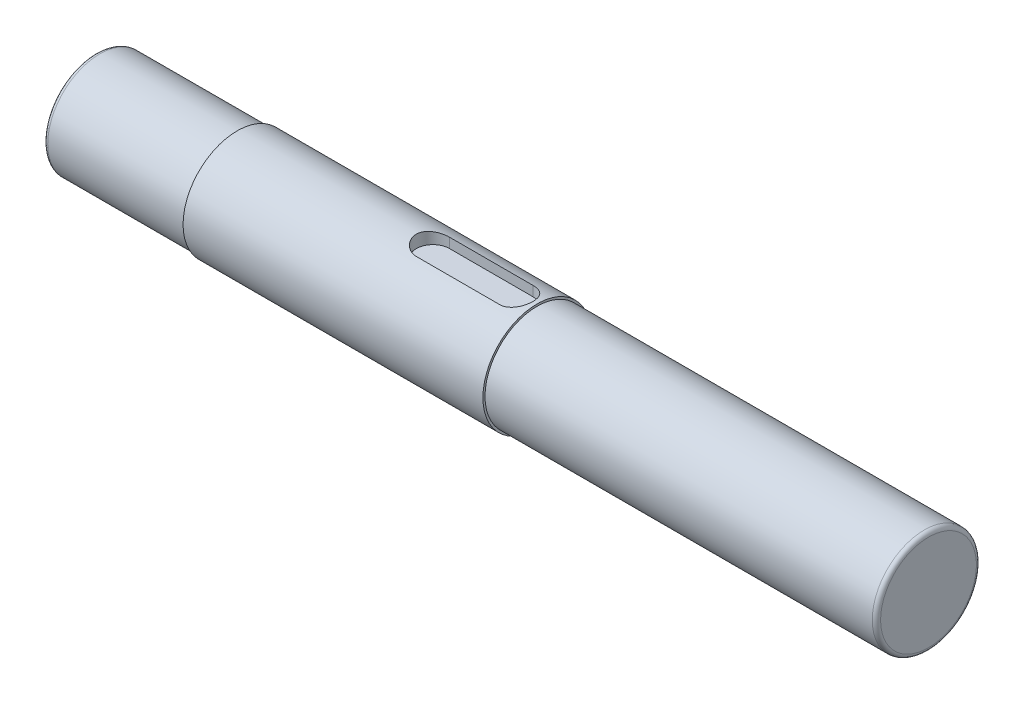
ISO-10303-21;
HEADER;
FILE_DESCRIPTION(('STEP AP214'),'2;1');
FILE_NAME('part.step','',(''),(''),'','','');
FILE_SCHEMA(('AUTOMOTIVE_DESIGN { 1 0 10303 214 1 1 1 1 }'));
ENDSEC;
DATA;
#1=APPLICATION_CONTEXT('core data for automotive mechanical design processes');
#2=APPLICATION_PROTOCOL_DEFINITION('international standard','automotive_design',2000,#1);
#3=PRODUCT_CONTEXT('',#1,'mechanical');
#4=PRODUCT('Part','Part','',(#3));
#5=PRODUCT_RELATED_PRODUCT_CATEGORY('part','',(#4));
#6=PRODUCT_DEFINITION_FORMATION('','',#4);
#7=PRODUCT_DEFINITION_CONTEXT('part definition',#1,'design');
#8=PRODUCT_DEFINITION('design','',#6,#7);
#9=PRODUCT_DEFINITION_SHAPE('','',#8);
#10=(LENGTH_UNIT() NAMED_UNIT(*) SI_UNIT(.MILLI.,.METRE.));
#11=(NAMED_UNIT(*) PLANE_ANGLE_UNIT() SI_UNIT($,.RADIAN.));
#12=(NAMED_UNIT(*) SI_UNIT($,.STERADIAN.) SOLID_ANGLE_UNIT());
#13=UNCERTAINTY_MEASURE_WITH_UNIT(LENGTH_MEASURE(1.E-05),#10,'distance_accuracy_value','');
#14=(GEOMETRIC_REPRESENTATION_CONTEXT(3) GLOBAL_UNCERTAINTY_ASSIGNED_CONTEXT((#13)) GLOBAL_UNIT_ASSIGNED_CONTEXT((#10,
#11,#12)) REPRESENTATION_CONTEXT('',''));
#15=CARTESIAN_POINT('',(0.,0.,0.));
#16=DIRECTION('',(0.,0.,1.));
#17=DIRECTION('',(1.,0.,0.));
#18=AXIS2_PLACEMENT_3D('',#15,#16,#17);
#19=CARTESIAN_POINT('',(7.6095238095238,0.,0.));
#20=DIRECTION('',(1.,0.,0.));
#21=DIRECTION('',(0.,0.,-1.));
#22=AXIS2_PLACEMENT_3D('',#19,#20,#21);
#23=PLANE('',#22);
#24=CARTESIAN_POINT('',(7.6095238095238,0.,0.));
#25=DIRECTION('',(1.,0.,0.));
#26=DIRECTION('',(0.,0.,-1.));
#27=AXIS2_PLACEMENT_3D('',#24,#25,#26);
#28=CIRCLE('',#27,11.5);
#29=CARTESIAN_POINT('',(7.6095238095238,0.,-11.5));
#30=VERTEX_POINT('',#29);
#31=EDGE_CURVE('E299',#30,#30,#28,.F.);
#32=ORIENTED_EDGE('',*,*,#31,.T.);
#33=EDGE_LOOP('',(#32));
#34=FACE_BOUND('',#33,.T.);
#35=ADVANCED_FACE('F71',(#34),#23,.F.);
#36=CARTESIAN_POINT('',(0.,0.,0.));
#37=DIRECTION('',(-1.,0.,0.));
#38=DIRECTION('',(0.,0.,1.));
#39=AXIS2_PLACEMENT_3D('',#36,#37,#38);
#40=CYLINDRICAL_SURFACE('',#39,12.5);
#41=CARTESIAN_POINT('',(8.6095238095238,0.,0.));
#42=DIRECTION('',(1.,0.,0.));
#43=DIRECTION('',(0.,0.,-1.));
#44=AXIS2_PLACEMENT_3D('',#41,#42,#43);
#45=CIRCLE('',#44,12.5);
#46=CARTESIAN_POINT('',(8.6095238095238,0.,-12.5));
#47=VERTEX_POINT('',#46);
#48=EDGE_CURVE('E307',#47,#47,#45,.T.);
#49=ORIENTED_EDGE('',*,*,#48,.T.);
#50=EDGE_LOOP('',(#49));
#51=FACE_BOUND('',#50,.T.);
#52=CARTESIAN_POINT('',(41.6095238095238,0.,0.));
#53=DIRECTION('',(-1.,0.,0.));
#54=DIRECTION('',(0.,0.,1.));
#55=AXIS2_PLACEMENT_3D('',#52,#53,#54);
#56=CIRCLE('',#55,12.5);
#57=CARTESIAN_POINT('',(41.6095238095238,0.,12.5));
#58=VERTEX_POINT('',#57);
#59=EDGE_CURVE('E219',#58,#58,#56,.T.);
#60=ORIENTED_EDGE('',*,*,#59,.T.);
#61=EDGE_LOOP('',(#60));
#62=FACE_BOUND('',#61,.T.);
#63=ADVANCED_FACE('F268',(#51,#62),#40,.T.);
#64=CARTESIAN_POINT('',(41.6095238095238,12.5,0.));
#65=DIRECTION('',(1.,0.,0.));
#66=DIRECTION('',(0.,0.,-1.));
#67=AXIS2_PLACEMENT_3D('',#64,#65,#66);
#68=PLANE('',#67);
#69=ORIENTED_EDGE('',*,*,#59,.F.);
#70=EDGE_LOOP('',(#69));
#71=FACE_BOUND('',#70,.T.);
#72=CARTESIAN_POINT('',(41.6095238095238,0.,0.));
#73=DIRECTION('',(-1.,0.,0.));
#74=DIRECTION('',(0.,0.,1.));
#75=AXIS2_PLACEMENT_3D('',#72,#73,#74);
#76=CIRCLE('',#75,13.);
#77=CARTESIAN_POINT('',(41.6095238095238,0.,13.));
#78=VERTEX_POINT('',#77);
#79=EDGE_CURVE('E215',#78,#78,#76,.T.);
#80=ORIENTED_EDGE('',*,*,#79,.T.);
#81=EDGE_LOOP('',(#80));
#82=FACE_BOUND('',#81,.T.);
#83=ADVANCED_FACE('F274',(#71,#82),#68,.F.);
#84=CARTESIAN_POINT('',(0.,0.,0.));
#85=DIRECTION('',(-1.,0.,0.));
#86=DIRECTION('',(0.,0.,1.));
#87=AXIS2_PLACEMENT_3D('',#84,#85,#86);
#88=CYLINDRICAL_SURFACE('',#87,13.);
#89=DIRECTION('',(-1.,0.,0.));
#90=VECTOR('',#89,1.);
#91=CARTESIAN_POINT('',(0.,12.369316876853,-4.));
#92=LINE('',#91,#90);
#93=CARTESIAN_POINT('',(88.6095238095238,12.369316876853,-4.));
#94=VERTEX_POINT('',#93);
#95=CARTESIAN_POINT('',(108.609523809524,12.369316876853,-4.));
#96=VERTEX_POINT('',#95);
#97=EDGE_CURVE('E12',#94,#96,#92,.F.);
#98=ORIENTED_EDGE('',*,*,#97,.T.);
#99=CARTESIAN_POINT('',(108.609523809524,12.369316876853,-4.));
#100=CARTESIAN_POINT('',(108.719161069568,12.3693011060559,-4.00001385554605));
#101=CARTESIAN_POINT('',(108.828789340904,12.3707741918502,-3.99549264927955));
#102=CARTESIAN_POINT('',(109.047206179603,12.3765808295348,-3.97748793948736));
#103=CARTESIAN_POINT('',(109.15599493797,12.3809137101209,-3.96400653926006));
#104=CARTESIAN_POINT('',(109.371679960723,12.3923078282768,-3.9282361528359));
#105=CARTESIAN_POINT('',(109.478580440909,12.399361878995,-3.90597036349973));
#106=CARTESIAN_POINT('',(109.689999698896,12.4159696129904,-3.85285190224662));
#107=CARTESIAN_POINT('',(109.79451840914,12.4255233670738,-3.82199898709017));
#108=CARTESIAN_POINT('',(110.103337421468,12.4575175837827,-3.71694513232446));
#109=CARTESIAN_POINT('',(110.303184773377,12.483307156321,-3.63020142616738));
#110=CARTESIAN_POINT('',(110.685496866216,12.5408839490093,-3.42599155981652));
#111=CARTESIAN_POINT('',(110.867952880525,12.572674156561,-3.30851008560228));
#112=CARTESIAN_POINT('',(111.216418280009,12.639849464286,-3.04197546692094));
#113=CARTESIAN_POINT('',(111.381770215115,12.6753137902419,-2.892081048213));
#114=CARTESIAN_POINT('',(111.68542887014,12.7451676286833,-2.56677638136854));
#115=CARTESIAN_POINT('',(111.823730970246,12.7795569567298,-2.391361783573));
#116=CARTESIAN_POINT('',(112.07227295929,12.8442939900254,-2.01525564040857));
#117=CARTESIAN_POINT('',(112.181833255872,12.8745369018167,-1.81409533176948));
#118=CARTESIAN_POINT('',(112.365304923956,12.9266435229377,-1.39512400470614));
#119=CARTESIAN_POINT('',(112.439225861867,12.9485094805068,-1.17731747270964));
#120=CARTESIAN_POINT('',(112.547124646301,12.980836680659,-0.738159816541966));
#121=CARTESIAN_POINT('',(112.582233643573,12.9916202110484,-0.517110769217928));
#122=CARTESIAN_POINT('',(112.615093066478,13.0017046486491,-0.0720095541966277));
#123=CARTESIAN_POINT('',(112.612850968841,13.0010078539271,0.152042003503076));
#124=CARTESIAN_POINT('',(112.571820628437,12.9884354452262,0.588828322821336));
#125=CARTESIAN_POINT('',(112.534258740302,12.976934963743,0.801690801267575));
#126=CARTESIAN_POINT('',(112.425663661769,12.9445067865243,1.21792737916861));
#127=CARTESIAN_POINT('',(112.354628688465,12.923578588635,1.42130097257467));
#128=CARTESIAN_POINT('',(112.180301444969,12.8741371346781,1.81565284792357));
#129=CARTESIAN_POINT('',(112.076631492816,12.8455356806846,2.00645263453306));
#130=CARTESIAN_POINT('',(111.840269522447,12.7837686435913,2.36833420473324));
#131=CARTESIAN_POINT('',(111.707570673614,12.7506019869631,2.53941133301027));
#132=CARTESIAN_POINT('',(111.410648898159,12.6816648743268,2.86427703670677));
#133=CARTESIAN_POINT('',(111.245369605203,12.6458433558745,3.01708885727141));
#134=CARTESIAN_POINT('',(110.891036459927,12.5767737605626,3.29318735472968));
#135=CARTESIAN_POINT('',(110.701975563289,12.5435264509396,3.41646525186121));
#136=CARTESIAN_POINT('',(110.403363411261,12.4983185398609,3.57703281324441));
#137=CARTESIAN_POINT('',(110.300660110085,12.4839545575701,3.62672040705995));
#138=CARTESIAN_POINT('',(110.091169262062,12.4573073197885,3.7172196774293));
#139=CARTESIAN_POINT('',(109.984383413734,12.4450232102832,3.75803499898249));
#140=CARTESIAN_POINT('',(109.767598395146,12.4229432446499,3.8303933226437));
#141=CARTESIAN_POINT('',(109.657602766054,12.413144753996,3.86194614776658));
#142=CARTESIAN_POINT('',(109.435152474813,12.3963449677289,3.91553543389294));
#143=CARTESIAN_POINT('',(109.322698969304,12.3893423850733,3.93757627393456));
#144=CARTESIAN_POINT('',(109.11021189705,12.3790500430556,3.96980876445186));
#145=CARTESIAN_POINT('',(109.010365129732,12.3754078485105,3.98112989977237));
#146=CARTESIAN_POINT('',(108.810189444419,12.3705374921443,3.9962248840057));
#147=CARTESIAN_POINT('',(108.709861426896,12.3693058643752,4.00000956907256));
#148=CARTESIAN_POINT('',(108.609523809524,12.369316876853,4.));
#149=B_SPLINE_CURVE_WITH_KNOTS('',3,(#99,#100,#101,#102,#103,#104,#105,#106,#107,#108,#109,#110,
#111,#112,#113,#114,#115,#116,#117,#118,#119,#120,#121,#122,#123,#124,#125,#126,#127,#128,#129,
#130,#131,#132,#133,#134,#135,#136,#137,#138,#139,#140,#141,#142,#143,#144,#145,#146,#147,#148),
.UNSPECIFIED.,.F.,.F.,(4,2,2,2,2,2,2,2,2,2,2,2,2,2,2,2,2,2,2,2,2,2,2,2,4),(0.,0.328793421203149,
0.65750968932791,0.985363667706895,1.31322693384514,1.96809857989085,2.6232971162299,
3.29814780038951,3.97311364113685,4.66283549043959,5.35237209962388,6.02123451698755,
6.68996304687303,7.33629750679724,7.98266639687212,8.63680913532383,9.2911059621096,
9.97181686260364,10.6527298725226,10.9973477032526,11.3418236857872,11.6859330155993,
12.0298837581651,12.3312338730857,12.6321503832144),.UNSPECIFIED.);
#150=CARTESIAN_POINT('',(108.609523809524,12.369316876853,4.));
#151=VERTEX_POINT('',#150);
#152=EDGE_CURVE('E311',#96,#151,#149,.T.);
#153=ORIENTED_EDGE('',*,*,#152,.T.);
#154=DIRECTION('',(-1.,0.,0.));
#155=VECTOR('',#154,1.);
#156=CARTESIAN_POINT('',(0.,12.369316876853,4.));
#157=LINE('',#156,#155);
#158=CARTESIAN_POINT('',(88.6095238095238,12.369316876853,4.));
#159=VERTEX_POINT('',#158);
#160=EDGE_CURVE('E80',#151,#159,#157,.T.);
#161=ORIENTED_EDGE('',*,*,#160,.T.);
#162=CARTESIAN_POINT('',(88.6095238095238,12.369316876853,4.));
#163=CARTESIAN_POINT('',(88.4998865494792,12.3693011060559,4.00001385554605));
#164=CARTESIAN_POINT('',(88.3902582781433,12.3707741918502,3.99549264927955));
#165=CARTESIAN_POINT('',(88.1718414394449,12.3765808295348,3.97748793948736));
#166=CARTESIAN_POINT('',(88.0630526810779,12.3809137101209,3.96400653926006));
#167=CARTESIAN_POINT('',(87.8473676583249,12.3923078282768,3.9282361528359));
#168=CARTESIAN_POINT('',(87.7404671781385,12.399361878995,3.90597036349973));
#169=CARTESIAN_POINT('',(87.5290479201514,12.4159696129904,3.85285190224662));
#170=CARTESIAN_POINT('',(87.4245292099075,12.4255233670738,3.82199898709017));
#171=CARTESIAN_POINT('',(87.1157101975799,12.4575175837827,3.71694513232447));
#172=CARTESIAN_POINT('',(86.9158628456706,12.483307156321,3.63020142616738));
#173=CARTESIAN_POINT('',(86.5335507528315,12.5408839490093,3.42599155981653));
#174=CARTESIAN_POINT('',(86.3510947385224,12.572674156561,3.30851008560229));
#175=CARTESIAN_POINT('',(86.0026293390387,12.639849464286,3.04197546692094));
#176=CARTESIAN_POINT('',(85.8372774039326,12.6753137902419,2.892081048213));
#177=CARTESIAN_POINT('',(85.5336187489077,12.7451676286833,2.56677638136855));
#178=CARTESIAN_POINT('',(85.3953166488018,12.7795569567298,2.391361783573));
#179=CARTESIAN_POINT('',(85.1467746597575,12.8442939900254,2.01525564040856));
#180=CARTESIAN_POINT('',(85.0372143631761,12.8745369018167,1.81409533176948));
#181=CARTESIAN_POINT('',(84.8537426950913,12.9266435229377,1.39512400470614));
#182=CARTESIAN_POINT('',(84.7798217571801,12.9485094805068,1.17731747270964));
#183=CARTESIAN_POINT('',(84.6719229727468,12.980836680659,0.738159816541966));
#184=CARTESIAN_POINT('',(84.6368139754744,12.9916202110484,0.517110769217928));
#185=CARTESIAN_POINT('',(84.6039545525696,13.0017046486491,0.072009554196628));
#186=CARTESIAN_POINT('',(84.6061966502066,13.0010078539271,-0.152042003503076));
#187=CARTESIAN_POINT('',(84.6472269906101,12.9884354452262,-0.588828322821337));
#188=CARTESIAN_POINT('',(84.6847888787455,12.976934963743,-0.801690801267578));
#189=CARTESIAN_POINT('',(84.7933839572789,12.9445067865243,-1.21792737916861));
#190=CARTESIAN_POINT('',(84.8644189305823,12.923578588635,-1.42130097257467));
#191=CARTESIAN_POINT('',(85.0387461740784,12.8741371346781,-1.81565284792358));
#192=CARTESIAN_POINT('',(85.1424161262319,12.8455356806846,-2.00645263453306));
#193=CARTESIAN_POINT('',(85.3787780966005,12.7837686435913,-2.36833420473324));
#194=CARTESIAN_POINT('',(85.5114769454333,12.7506019869631,-2.53941133301027));
#195=CARTESIAN_POINT('',(85.8083987208882,12.6816648743268,-2.86427703670677));
#196=CARTESIAN_POINT('',(85.9736780138446,12.6458433558745,-3.01708885727141));
#197=CARTESIAN_POINT('',(86.3280111591204,12.5767737605626,-3.29318735472968));
#198=CARTESIAN_POINT('',(86.5170720557584,12.5435264509396,-3.41646525186121));
#199=CARTESIAN_POINT('',(86.8156842077862,12.4983185398609,-3.57703281324441));
#200=CARTESIAN_POINT('',(86.918387508963,12.4839545575701,-3.62672040705996));
#201=CARTESIAN_POINT('',(87.1278783569855,12.4573073197885,-3.7172196774293));
#202=CARTESIAN_POINT('',(87.234664205314,12.4450232102832,-3.75803499898249));
#203=CARTESIAN_POINT('',(87.4514492239018,12.4229432446499,-3.83039332264369));
#204=CARTESIAN_POINT('',(87.5614448529935,12.413144753996,-3.86194614776658));
#205=CARTESIAN_POINT('',(87.7838951442344,12.3963449677289,-3.91553543389294));
#206=CARTESIAN_POINT('',(87.8963486497438,12.3893423850733,-3.93757627393456));
#207=CARTESIAN_POINT('',(88.1088357219976,12.3790500430556,-3.96980876445186));
#208=CARTESIAN_POINT('',(88.2086824893152,12.3754078485105,-3.98112989977237));
#209=CARTESIAN_POINT('',(88.4088581746287,12.3705374921443,-3.9962248840057));
#210=CARTESIAN_POINT('',(88.5091861921521,12.3693058643752,-4.00000956907256));
#211=CARTESIAN_POINT('',(88.6095238095238,12.369316876853,-4.));
#212=B_SPLINE_CURVE_WITH_KNOTS('',3,(#162,#163,#164,#165,#166,#167,#168,#169,#170,#171,#172,
#173,#174,#175,#176,#177,#178,#179,#180,#181,#182,#183,#184,#185,#186,#187,#188,#189,#190,#191,
#192,#193,#194,#195,#196,#197,#198,#199,#200,#201,#202,#203,#204,#205,#206,#207,#208,#209,#210,
#211),.UNSPECIFIED.,.F.,.F.,(4,2,2,2,2,2,2,2,2,2,2,2,2,2,2,2,2,2,2,2,2,2,2,2,4),(0.,
0.328793421203149,0.65750968932791,0.985363667706909,1.31322693384514,1.96809857989083,
2.6232971162299,3.2981478003895,3.97311364113685,4.66283549043959,5.35237209962388,
6.02123451698755,6.68996304687303,7.33629750679724,7.98266639687212,8.63680913532383,
9.2911059621096,9.97181686260362,10.6527298725226,10.9973477032526,11.3418236857872,
11.6859330155993,12.0298837581651,12.3312338730857,12.6321503832144),.UNSPECIFIED.);
#213=EDGE_CURVE('E87',#159,#94,#212,.T.);
#214=ORIENTED_EDGE('',*,*,#213,.T.);
#215=EDGE_LOOP('',(#98,#153,#161,#214));
#216=FACE_BOUND('',#215,.T.);
#217=ORIENTED_EDGE('',*,*,#79,.F.);
#218=EDGE_LOOP('',(#217));
#219=FACE_BOUND('',#218,.T.);
#220=CARTESIAN_POINT('',(113.609523809524,0.,0.));
#221=DIRECTION('',(-1.,0.,0.));
#222=DIRECTION('',(0.,0.,1.));
#223=AXIS2_PLACEMENT_3D('',#220,#221,#222);
#224=CIRCLE('',#223,13.);
#225=CARTESIAN_POINT('',(113.609523809524,0.,13.));
#226=VERTEX_POINT('',#225);
#227=EDGE_CURVE('E211',#226,#226,#224,.T.);
#228=ORIENTED_EDGE('',*,*,#227,.T.);
#229=EDGE_LOOP('',(#228));
#230=FACE_BOUND('',#229,.T.);
#231=ADVANCED_FACE('F326',(#216,#219,#230),#88,.T.);
#232=CARTESIAN_POINT('',(113.609523809524,13.,0.));
#233=DIRECTION('',(-1.,0.,0.));
#234=DIRECTION('',(0.,0.,1.));
#235=AXIS2_PLACEMENT_3D('',#232,#233,#234);
#236=PLANE('',#235);
#237=ORIENTED_EDGE('',*,*,#227,.F.);
#238=EDGE_LOOP('',(#237));
#239=FACE_BOUND('',#238,.T.);
#240=CARTESIAN_POINT('',(113.609523809524,0.,0.));
#241=DIRECTION('',(-1.,0.,0.));
#242=DIRECTION('',(0.,0.,1.));
#243=AXIS2_PLACEMENT_3D('',#240,#241,#242);
#244=CIRCLE('',#243,12.5);
#245=CARTESIAN_POINT('',(113.609523809524,0.,12.5));
#246=VERTEX_POINT('',#245);
#247=EDGE_CURVE('E197',#246,#246,#244,.T.);
#248=ORIENTED_EDGE('',*,*,#247,.T.);
#249=EDGE_LOOP('',(#248));
#250=FACE_BOUND('',#249,.T.);
#251=ADVANCED_FACE('F264',(#239,#250),#236,.F.);
#252=CARTESIAN_POINT('',(0.,0.,0.));
#253=DIRECTION('',(-1.,0.,0.));
#254=DIRECTION('',(0.,0.,1.));
#255=AXIS2_PLACEMENT_3D('',#252,#253,#254);
#256=CYLINDRICAL_SURFACE('',#255,12.5);
#257=CARTESIAN_POINT('',(206.609523809524,0.,0.));
#258=DIRECTION('',(-1.,0.,0.));
#259=DIRECTION('',(0.,0.,1.));
#260=AXIS2_PLACEMENT_3D('',#257,#258,#259);
#261=CIRCLE('',#260,12.5);
#262=CARTESIAN_POINT('',(206.609523809524,0.,12.5));
#263=VERTEX_POINT('',#262);
#264=EDGE_CURVE('E293',#263,#263,#261,.T.);
#265=ORIENTED_EDGE('',*,*,#264,.T.);
#266=EDGE_LOOP('',(#265));
#267=FACE_BOUND('',#266,.T.);
#268=DIRECTION('',(-1.,0.,0.));
#269=VECTOR('',#268,1.);
#270=CARTESIAN_POINT('',(0.,-11.842719282327,-4.));
#271=LINE('',#270,#269);
#272=CARTESIAN_POINT('',(139.309523809524,-11.842719282327,-4.));
#273=VERTEX_POINT('',#272);
#274=CARTESIAN_POINT('',(119.309523809524,-11.842719282327,-4.));
#275=VERTEX_POINT('',#274);
#276=EDGE_CURVE('E295',#273,#275,#271,.T.);
#277=ORIENTED_EDGE('',*,*,#276,.T.);
#278=CARTESIAN_POINT('',(119.309523809524,-11.842719282327,-4.));
#279=CARTESIAN_POINT('',(119.200124037562,-11.8427027366058,-4.00001410484613));
#280=CARTESIAN_POINT('',(119.090733599676,-11.8442348052368,-3.995512175201));
#281=CARTESIAN_POINT('',(118.872795568787,-11.8502730910574,-3.97758606678449));
#282=CARTESIAN_POINT('',(118.764247771039,-11.8547785613244,-3.96416412872571));
#283=CARTESIAN_POINT('',(118.549062778678,-11.8666242076309,-3.9285572511943));
#284=CARTESIAN_POINT('',(118.442421113913,-11.8739564736691,-3.9063967602145));
#285=CARTESIAN_POINT('',(118.231518171152,-11.8912164993788,-3.85353581488657));
#286=CARTESIAN_POINT('',(118.127256969367,-11.90114434202,-3.82283508754056));
#287=CARTESIAN_POINT('',(117.819218805245,-11.9343840843196,-3.71831764495512));
#288=CARTESIAN_POINT('',(117.619887257456,-11.9611699822066,-3.63203544139888));
#289=CARTESIAN_POINT('',(117.238511252482,-12.0209583955878,-3.42895021192288));
#290=CARTESIAN_POINT('',(117.056476430474,-12.0539643457894,-3.31213030924909));
#291=CARTESIAN_POINT('',(116.708269820925,-12.123798407807,-3.0467850788479));
#292=CARTESIAN_POINT('',(116.542805485184,-12.1607158548651,-2.89735303896515));
#293=CARTESIAN_POINT('',(116.238808960935,-12.2334561140966,-2.57296449846117));
#294=CARTESIAN_POINT('',(116.100281461166,-12.2692787347869,-2.39800356343233));
#295=CARTESIAN_POINT('',(115.850908611153,-12.3368244653945,-2.02237003010513));
#296=CARTESIAN_POINT('',(115.740801853054,-12.3684294972003,-1.82118394546977));
#297=CARTESIAN_POINT('',(115.556274314174,-12.4229251649937,-1.4019719735037));
#298=CARTESIAN_POINT('',(115.481843335742,-12.4458182908278,-1.18395091903582));
#299=CARTESIAN_POINT('',(115.373164945273,-12.4796767811416,-0.744713961063374));
#300=CARTESIAN_POINT('',(115.337698876144,-12.4910030499338,-0.523827920101165));
#301=CARTESIAN_POINT('',(115.304091010482,-12.5017287122873,-0.0789648151746457));
#302=CARTESIAN_POINT('',(115.305941075999,-12.5011307063103,0.145011564197636));
#303=CARTESIAN_POINT('',(115.346122638795,-12.4883236673358,0.581094974437686));
#304=CARTESIAN_POINT('',(115.383131577503,-12.4765355800409,0.793338226675231));
#305=CARTESIAN_POINT('',(115.49040436113,-12.443194578958,1.2084232001272));
#306=CARTESIAN_POINT('',(115.560670016957,-12.4216411334261,1.41126440871778));
#307=CARTESIAN_POINT('',(115.73328165176,-12.3706364987475,1.80478548808183));
#308=CARTESIAN_POINT('',(115.836020329393,-12.3410893067347,1.99528012693526));
#309=CARTESIAN_POINT('',(116.070352858569,-12.2771965403044,2.35673113106228));
#310=CARTESIAN_POINT('',(116.201954015927,-12.2428497517893,2.5276825327575));
#311=CARTESIAN_POINT('',(116.496970340815,-12.1712409097156,2.85304511528221));
#312=CARTESIAN_POINT('',(116.661520512116,-12.1339170352569,3.00641313381737));
#313=CARTESIAN_POINT('',(117.014495709609,-12.0618172896256,3.28377291775701));
#314=CARTESIAN_POINT('',(117.202928068356,-12.0270422062066,3.40775562728565));
#315=CARTESIAN_POINT('',(117.500895047272,-11.9796198433082,3.56958208232607));
#316=CARTESIAN_POINT('',(117.603522868765,-11.9645161845072,3.61975674493765));
#317=CARTESIAN_POINT('',(117.812928562276,-11.9364591580623,3.71123075156256));
#318=CARTESIAN_POINT('',(117.91970469731,-11.9235049021446,3.75253376401034));
#319=CARTESIAN_POINT('',(118.136537137415,-11.9001802342949,3.82585831579179));
#320=CARTESIAN_POINT('',(118.246589787497,-11.889807055759,3.85788979915529));
#321=CARTESIAN_POINT('',(118.469218966471,-11.8719756673203,3.91241790563964));
#322=CARTESIAN_POINT('',(118.581794313321,-11.8645161211931,3.93491889994975));
#323=CARTESIAN_POINT('',(118.796763055385,-11.8533815888388,3.96832908530803));
#324=CARTESIAN_POINT('',(118.898991225318,-11.8493925948395,3.9802038456482));
#325=CARTESIAN_POINT('',(119.103984887557,-11.8440568016292,3.99603937127681));
#326=CARTESIAN_POINT('',(119.206749447804,-11.8427063770563,4.00001099551563));
#327=CARTESIAN_POINT('',(119.309523809524,-11.842719282327,4.));
#328=B_SPLINE_CURVE_WITH_KNOTS('',3,(#278,#279,#280,#281,#282,#283,#284,#285,#286,#287,#288,
#289,#290,#291,#292,#293,#294,#295,#296,#297,#298,#299,#300,#301,#302,#303,#304,#305,#306,#307,
#308,#309,#310,#311,#312,#313,#314,#315,#316,#317,#318,#319,#320,#321,#322,#323,#324,#325,#326,
#327),.UNSPECIFIED.,.F.,.F.,(4,2,2,2,2,2,2,2,2,2,2,2,2,2,2,2,2,2,2,2,2,2,2,2,4),(0.,
0.328080176984097,0.656077971124936,0.983164539368213,1.31026156448799,1.96355293984249,
2.61720612481382,3.29209427898755,3.96709980211696,4.65819584662373,5.34909422856992,
6.01770820975085,6.68617638029993,7.3304550155383,7.97476873730064,8.62719320105811,
9.27978300073407,9.96076419384898,10.6419549776068,10.9872862883783,11.3324745283028,
11.6772911585126,12.0219494657669,12.3305938648259,12.6388138912331),.UNSPECIFIED.);
#329=CARTESIAN_POINT('',(119.309523809524,-11.842719282327,4.));
#330=VERTEX_POINT('',#329);
#331=EDGE_CURVE('E223',#275,#330,#328,.T.);
#332=ORIENTED_EDGE('',*,*,#331,.T.);
#333=DIRECTION('',(-1.,0.,0.));
#334=VECTOR('',#333,1.);
#335=CARTESIAN_POINT('',(0.,-11.842719282327,4.));
#336=LINE('',#335,#334);
#337=CARTESIAN_POINT('',(139.309523809524,-11.842719282327,4.));
#338=VERTEX_POINT('',#337);
#339=EDGE_CURVE('E302',#330,#338,#336,.F.);
#340=ORIENTED_EDGE('',*,*,#339,.T.);
#341=CARTESIAN_POINT('',(139.309523809524,-11.842719282327,4.));
#342=CARTESIAN_POINT('',(139.418923581486,-11.8427027366058,4.00001410484613));
#343=CARTESIAN_POINT('',(139.528314019372,-11.8442348052368,3.995512175201));
#344=CARTESIAN_POINT('',(139.74625205026,-11.8502730910574,3.9775860667845));
#345=CARTESIAN_POINT('',(139.854799848008,-11.8547785613244,3.96416412872571));
#346=CARTESIAN_POINT('',(140.069984840369,-11.8666242076309,3.9285572511943));
#347=CARTESIAN_POINT('',(140.176626505135,-11.8739564736691,3.9063967602145));
#348=CARTESIAN_POINT('',(140.387529447896,-11.8912164993788,3.85353581488657));
#349=CARTESIAN_POINT('',(140.491790649681,-11.90114434202,3.82283508754057));
#350=CARTESIAN_POINT('',(140.799828813802,-11.9343840843196,3.71831764495513));
#351=CARTESIAN_POINT('',(140.999160361592,-11.9611699822066,3.63203544139887));
#352=CARTESIAN_POINT('',(141.380536366566,-12.0209583955878,3.42895021192288));
#353=CARTESIAN_POINT('',(141.562571188574,-12.0539643457894,3.31213030924911));
#354=CARTESIAN_POINT('',(141.910777798123,-12.123798407807,3.04678507884792));
#355=CARTESIAN_POINT('',(142.076242133863,-12.1607158548651,2.89735303896515));
#356=CARTESIAN_POINT('',(142.380238658113,-12.2334561140966,2.57296449846117));
#357=CARTESIAN_POINT('',(142.518766157882,-12.2692787347869,2.39800356343233));
#358=CARTESIAN_POINT('',(142.768139007895,-12.3368244653945,2.02237003010512));
#359=CARTESIAN_POINT('',(142.878245765994,-12.3684294972003,1.82118394546976));
#360=CARTESIAN_POINT('',(143.062773304873,-12.4229251649937,1.40197197350369));
#361=CARTESIAN_POINT('',(143.137204283306,-12.4458182908278,1.18395091903582));
#362=CARTESIAN_POINT('',(143.245882673774,-12.4796767811416,0.744713961063377));
#363=CARTESIAN_POINT('',(143.281348742904,-12.4910030499338,0.523827920101166));
#364=CARTESIAN_POINT('',(143.314956608566,-12.5017287122873,0.0789648151746453));
#365=CARTESIAN_POINT('',(143.313106543049,-12.5011307063103,-0.145011564197635));
#366=CARTESIAN_POINT('',(143.272924980253,-12.4883236673358,-0.581094974437689));
#367=CARTESIAN_POINT('',(143.235916041545,-12.4765355800409,-0.793338226675238));
#368=CARTESIAN_POINT('',(143.128643257918,-12.443194578958,-1.2084232001272));
#369=CARTESIAN_POINT('',(143.058377602091,-12.4216411334261,-1.41126440871777));
#370=CARTESIAN_POINT('',(142.885765967288,-12.3706364987475,-1.80478548808182));
#371=CARTESIAN_POINT('',(142.783027289655,-12.3410893067347,-1.99528012693527));
#372=CARTESIAN_POINT('',(142.548694760479,-12.2771965403044,-2.35673113106229));
#373=CARTESIAN_POINT('',(142.417093603121,-12.2428497517893,-2.5276825327575));
#374=CARTESIAN_POINT('',(142.122077278232,-12.1712409097156,-2.8530451152822));
#375=CARTESIAN_POINT('',(141.957527106932,-12.1339170352569,-3.00641313381736));
#376=CARTESIAN_POINT('',(141.604551909439,-12.0618172896256,-3.283772917757));
#377=CARTESIAN_POINT('',(141.416119550692,-12.0270422062066,-3.40775562728565));
#378=CARTESIAN_POINT('',(141.118152571775,-11.9796198433082,-3.56958208232606));
#379=CARTESIAN_POINT('',(141.015524750282,-11.9645161845072,-3.61975674493764));
#380=CARTESIAN_POINT('',(140.806119056772,-11.9364591580623,-3.71123075156255));
#381=CARTESIAN_POINT('',(140.699342921738,-11.9235049021446,-3.75253376401034));
#382=CARTESIAN_POINT('',(140.482510481632,-11.9001802342949,-3.82585831579179));
#383=CARTESIAN_POINT('',(140.372457831551,-11.889807055759,-3.85788979915529));
#384=CARTESIAN_POINT('',(140.149828652576,-11.8719756673203,-3.91241790563964));
#385=CARTESIAN_POINT('',(140.037253305727,-11.8645161211931,-3.93491889994976));
#386=CARTESIAN_POINT('',(139.822284563663,-11.8533815888388,-3.96832908530804));
#387=CARTESIAN_POINT('',(139.720056393729,-11.8493925948395,-3.9802038456482));
#388=CARTESIAN_POINT('',(139.515062731491,-11.8440568016292,-3.99603937127681));
#389=CARTESIAN_POINT('',(139.412298171243,-11.8427063770563,-4.00001099551563));
#390=CARTESIAN_POINT('',(139.309523809524,-11.842719282327,-4.));
#391=B_SPLINE_CURVE_WITH_KNOTS('',3,(#341,#342,#343,#344,#345,#346,#347,#348,#349,#350,#351,
#352,#353,#354,#355,#356,#357,#358,#359,#360,#361,#362,#363,#364,#365,#366,#367,#368,#369,#370,
#371,#372,#373,#374,#375,#376,#377,#378,#379,#380,#381,#382,#383,#384,#385,#386,#387,#388,#389,
#390),.UNSPECIFIED.,.F.,.F.,(4,2,2,2,2,2,2,2,2,2,2,2,2,2,2,2,2,2,2,2,2,2,2,2,4),(0.,
0.328080176984111,0.656077971124936,0.983164539368185,1.31026156448799,1.96355293984248,
2.61720612481379,3.29209427898754,3.96709980211696,4.65819584662372,5.34909422856991,
6.01770820975084,6.68617638029993,7.33045501553829,7.97476873730064,8.62719320105809,
9.27978300073407,9.96076419384895,10.6419549776068,10.9872862883783,11.3324745283028,
11.6772911585126,12.0219494657669,12.3305938648259,12.6388138912331),.UNSPECIFIED.);
#392=EDGE_CURVE('E95',#338,#273,#391,.T.);
#393=ORIENTED_EDGE('',*,*,#392,.T.);
#394=EDGE_LOOP('',(#277,#332,#340,#393));
#395=FACE_BOUND('',#394,.T.);
#396=ORIENTED_EDGE('',*,*,#247,.F.);
#397=EDGE_LOOP('',(#396));
#398=FACE_BOUND('',#397,.T.);
#399=ADVANCED_FACE('F239',(#267,#395,#398),#256,.T.);
#400=CARTESIAN_POINT('',(207.609523809524,12.5,0.));
#401=DIRECTION('',(-1.,0.,0.));
#402=DIRECTION('',(0.,0.,1.));
#403=AXIS2_PLACEMENT_3D('',#400,#401,#402);
#404=PLANE('',#403);
#405=CARTESIAN_POINT('',(207.609523809524,0.,0.));
#406=DIRECTION('',(-1.,0.,0.));
#407=DIRECTION('',(0.,0.,1.));
#408=AXIS2_PLACEMENT_3D('',#405,#406,#407);
#409=CIRCLE('',#408,11.5);
#410=CARTESIAN_POINT('',(207.609523809524,0.,11.5));
#411=VERTEX_POINT('',#410);
#412=EDGE_CURVE('E290',#411,#411,#409,.F.);
#413=ORIENTED_EDGE('',*,*,#412,.T.);
#414=EDGE_LOOP('',(#413));
#415=FACE_BOUND('',#414,.T.);
#416=ADVANCED_FACE('F258',(#415),#404,.F.);
#417=CARTESIAN_POINT('',(139.309523809524,-9.,0.));
#418=DIRECTION('',(0.,-1.,0.));
#419=DIRECTION('',(0.,0.,-1.));
#420=AXIS2_PLACEMENT_3D('',#417,#418,#419);
#421=CYLINDRICAL_SURFACE('',#420,4.);
#422=DIRECTION('',(0.,-1.,0.));
#423=VECTOR('',#422,1.);
#424=CARTESIAN_POINT('',(139.309523809524,-9.,4.));
#425=LINE('',#424,#423);
#426=CARTESIAN_POINT('',(139.309523809524,-9.,4.));
#427=VERTEX_POINT('',#426);
#428=EDGE_CURVE('E193',#427,#338,#425,.T.);
#429=ORIENTED_EDGE('',*,*,#428,.F.);
#430=CARTESIAN_POINT('',(139.309523809524,-9.,0.));
#431=DIRECTION('',(0.,-1.,0.));
#432=DIRECTION('',(0.,0.,-1.));
#433=AXIS2_PLACEMENT_3D('',#430,#431,#432);
#434=CIRCLE('',#433,4.);
#435=CARTESIAN_POINT('',(139.309523809524,-9.,-4.));
#436=VERTEX_POINT('',#435);
#437=EDGE_CURVE('E171',#436,#427,#434,.T.);
#438=ORIENTED_EDGE('',*,*,#437,.F.);
#439=DIRECTION('',(0.,-1.,0.));
#440=VECTOR('',#439,1.);
#441=CARTESIAN_POINT('',(139.309523809524,-9.,-4.));
#442=LINE('',#441,#440);
#443=EDGE_CURVE('E194',#436,#273,#442,.T.);
#444=ORIENTED_EDGE('',*,*,#443,.T.);
#445=ORIENTED_EDGE('',*,*,#392,.F.);
#446=EDGE_LOOP('',(#429,#438,#444,#445));
#447=FACE_BOUND('',#446,.T.);
#448=ADVANCED_FACE('F255',(#447),#421,.F.);
#449=CARTESIAN_POINT('',(139.309523809524,-9.,-4.));
#450=DIRECTION('',(0.,0.,-1.));
#451=DIRECTION('',(-1.,0.,0.));
#452=AXIS2_PLACEMENT_3D('',#449,#450,#451);
#453=PLANE('',#452);
#454=ORIENTED_EDGE('',*,*,#443,.F.);
#455=DIRECTION('',(1.,0.,0.));
#456=VECTOR('',#455,1.);
#457=CARTESIAN_POINT('',(139.309523809524,-9.,-4.));
#458=LINE('',#457,#456);
#459=CARTESIAN_POINT('',(119.309523809524,-9.,-4.));
#460=VERTEX_POINT('',#459);
#461=EDGE_CURVE('E189',#460,#436,#458,.T.);
#462=ORIENTED_EDGE('',*,*,#461,.F.);
#463=DIRECTION('',(0.,-1.,0.));
#464=VECTOR('',#463,1.);
#465=CARTESIAN_POINT('',(119.309523809524,-9.,-4.));
#466=LINE('',#465,#464);
#467=EDGE_CURVE('E198',#460,#275,#466,.T.);
#468=ORIENTED_EDGE('',*,*,#467,.T.);
#469=ORIENTED_EDGE('',*,*,#276,.F.);
#470=EDGE_LOOP('',(#454,#462,#468,#469));
#471=FACE_BOUND('',#470,.T.);
#472=ADVANCED_FACE('F249',(#471),#453,.F.);
#473=CARTESIAN_POINT('',(119.309523809524,-9.,0.));
#474=DIRECTION('',(0.,-1.,0.));
#475=DIRECTION('',(0.,0.,-1.));
#476=AXIS2_PLACEMENT_3D('',#473,#474,#475);
#477=CYLINDRICAL_SURFACE('',#476,4.);
#478=ORIENTED_EDGE('',*,*,#467,.F.);
#479=CARTESIAN_POINT('',(119.309523809524,-9.,0.));
#480=DIRECTION('',(0.,-1.,0.));
#481=DIRECTION('',(0.,0.,-1.));
#482=AXIS2_PLACEMENT_3D('',#479,#480,#481);
#483=CIRCLE('',#482,4.);
#484=CARTESIAN_POINT('',(119.309523809524,-9.,4.));
#485=VERTEX_POINT('',#484);
#486=EDGE_CURVE('E185',#485,#460,#483,.T.);
#487=ORIENTED_EDGE('',*,*,#486,.F.);
#488=DIRECTION('',(0.,-1.,0.));
#489=VECTOR('',#488,1.);
#490=CARTESIAN_POINT('',(119.309523809524,-9.,4.));
#491=LINE('',#490,#489);
#492=EDGE_CURVE('E202',#485,#330,#491,.T.);
#493=ORIENTED_EDGE('',*,*,#492,.T.);
#494=ORIENTED_EDGE('',*,*,#331,.F.);
#495=EDGE_LOOP('',(#478,#487,#493,#494));
#496=FACE_BOUND('',#495,.T.);
#497=ADVANCED_FACE('F243',(#496),#477,.F.);
#498=CARTESIAN_POINT('',(139.309523809524,-9.,4.));
#499=DIRECTION('',(0.,0.,1.));
#500=DIRECTION('',(1.,0.,0.));
#501=AXIS2_PLACEMENT_3D('',#498,#499,#500);
#502=PLANE('',#501);
#503=ORIENTED_EDGE('',*,*,#492,.F.);
#504=DIRECTION('',(-1.,0.,0.));
#505=VECTOR('',#504,1.);
#506=CARTESIAN_POINT('',(139.309523809524,-9.,4.));
#507=LINE('',#506,#505);
#508=EDGE_CURVE('E181',#427,#485,#507,.T.);
#509=ORIENTED_EDGE('',*,*,#508,.F.);
#510=ORIENTED_EDGE('',*,*,#428,.T.);
#511=ORIENTED_EDGE('',*,*,#339,.F.);
#512=EDGE_LOOP('',(#503,#509,#510,#511));
#513=FACE_BOUND('',#512,.T.);
#514=ADVANCED_FACE('F248',(#513),#502,.F.);
#515=CARTESIAN_POINT('',(139.309523809524,-9.,0.));
#516=DIRECTION('',(0.,-1.,0.));
#517=DIRECTION('',(0.,0.,-1.));
#518=AXIS2_PLACEMENT_3D('',#515,#516,#517);
#519=PLANE('',#518);
#520=ORIENTED_EDGE('',*,*,#437,.T.);
#521=ORIENTED_EDGE('',*,*,#508,.T.);
#522=ORIENTED_EDGE('',*,*,#486,.T.);
#523=ORIENTED_EDGE('',*,*,#461,.T.);
#524=EDGE_LOOP('',(#520,#521,#522,#523));
#525=FACE_BOUND('',#524,.T.);
#526=ADVANCED_FACE('F253',(#525),#519,.T.);
#527=CARTESIAN_POINT('',(206.609523809524,0.,0.));
#528=DIRECTION('',(-1.,0.,0.));
#529=DIRECTION('',(0.,0.,1.));
#530=AXIS2_PLACEMENT_3D('',#527,#528,#529);
#531=TOROIDAL_SURFACE('',#530,11.5,1.);
#532=ORIENTED_EDGE('',*,*,#412,.F.);
#533=EDGE_LOOP('',(#532));
#534=FACE_BOUND('',#533,.T.);
#535=ORIENTED_EDGE('',*,*,#264,.F.);
#536=EDGE_LOOP('',(#535));
#537=FACE_BOUND('',#536,.T.);
#538=ADVANCED_FACE('F279',(#534,#537),#531,.T.);
#539=CARTESIAN_POINT('',(8.6095238095238,0.,0.));
#540=DIRECTION('',(1.,0.,0.));
#541=DIRECTION('',(0.,0.,-1.));
#542=AXIS2_PLACEMENT_3D('',#539,#540,#541);
#543=TOROIDAL_SURFACE('',#542,11.5,1.);
#544=ORIENTED_EDGE('',*,*,#48,.F.);
#545=EDGE_LOOP('',(#544));
#546=FACE_BOUND('',#545,.T.);
#547=ORIENTED_EDGE('',*,*,#31,.F.);
#548=EDGE_LOOP('',(#547));
#549=FACE_BOUND('',#548,.T.);
#550=ADVANCED_FACE('F73',(#546,#549),#543,.T.);
#551=CARTESIAN_POINT('',(88.6095238095238,10.,0.));
#552=DIRECTION('',(0.,1.,0.));
#553=DIRECTION('',(0.,0.,1.));
#554=AXIS2_PLACEMENT_3D('',#551,#552,#553);
#555=CYLINDRICAL_SURFACE('',#554,4.);
#556=DIRECTION('',(0.,1.,0.));
#557=VECTOR('',#556,1.);
#558=CARTESIAN_POINT('',(88.6095238095238,10.,4.));
#559=LINE('',#558,#557);
#560=CARTESIAN_POINT('',(88.6095238095238,10.,4.));
#561=VERTEX_POINT('',#560);
#562=EDGE_CURVE('E137',#561,#159,#559,.T.);
#563=ORIENTED_EDGE('',*,*,#562,.F.);
#564=CARTESIAN_POINT('',(88.6095238095238,10.,0.));
#565=DIRECTION('',(0.,1.,0.));
#566=DIRECTION('',(0.,0.,1.));
#567=AXIS2_PLACEMENT_3D('',#564,#565,#566);
#568=CIRCLE('',#567,4.);
#569=CARTESIAN_POINT('',(88.6095238095238,10.,-4.));
#570=VERTEX_POINT('',#569);
#571=EDGE_CURVE('E141',#570,#561,#568,.T.);
#572=ORIENTED_EDGE('',*,*,#571,.F.);
#573=DIRECTION('',(0.,1.,0.));
#574=VECTOR('',#573,1.);
#575=CARTESIAN_POINT('',(88.6095238095238,10.,-4.));
#576=LINE('',#575,#574);
#577=EDGE_CURVE('E168',#570,#94,#576,.T.);
#578=ORIENTED_EDGE('',*,*,#577,.T.);
#579=ORIENTED_EDGE('',*,*,#213,.F.);
#580=EDGE_LOOP('',(#563,#572,#578,#579));
#581=FACE_BOUND('',#580,.T.);
#582=ADVANCED_FACE('F139',(#581),#555,.F.);
#583=CARTESIAN_POINT('',(88.6095238095238,10.,-4.));
#584=DIRECTION('',(0.,0.,-1.));
#585=DIRECTION('',(0.,1.,0.));
#586=AXIS2_PLACEMENT_3D('',#583,#584,#585);
#587=PLANE('',#586);
#588=ORIENTED_EDGE('',*,*,#577,.F.);
#589=DIRECTION('',(-1.,0.,0.));
#590=VECTOR('',#589,1.);
#591=CARTESIAN_POINT('',(88.6095238095238,10.,-4.));
#592=LINE('',#591,#590);
#593=CARTESIAN_POINT('',(108.609523809524,10.,-4.));
#594=VERTEX_POINT('',#593);
#595=EDGE_CURVE('E147',#594,#570,#592,.T.);
#596=ORIENTED_EDGE('',*,*,#595,.F.);
#597=DIRECTION('',(0.,1.,0.));
#598=VECTOR('',#597,1.);
#599=CARTESIAN_POINT('',(108.609523809524,10.,-4.));
#600=LINE('',#599,#598);
#601=EDGE_CURVE('E172',#594,#96,#600,.T.);
#602=ORIENTED_EDGE('',*,*,#601,.T.);
#603=ORIENTED_EDGE('',*,*,#97,.F.);
#604=EDGE_LOOP('',(#588,#596,#602,#603));
#605=FACE_BOUND('',#604,.T.);
#606=ADVANCED_FACE('F333',(#605),#587,.F.);
#607=CARTESIAN_POINT('',(108.609523809524,10.,0.));
#608=DIRECTION('',(0.,1.,0.));
#609=DIRECTION('',(0.,0.,1.));
#610=AXIS2_PLACEMENT_3D('',#607,#608,#609);
#611=CYLINDRICAL_SURFACE('',#610,4.);
#612=ORIENTED_EDGE('',*,*,#601,.F.);
#613=CARTESIAN_POINT('',(108.609523809524,10.,0.));
#614=DIRECTION('',(0.,1.,0.));
#615=DIRECTION('',(0.,0.,1.));
#616=AXIS2_PLACEMENT_3D('',#613,#614,#615);
#617=CIRCLE('',#616,4.);
#618=CARTESIAN_POINT('',(108.609523809524,10.,4.));
#619=VERTEX_POINT('',#618);
#620=EDGE_CURVE('E157',#619,#594,#617,.T.);
#621=ORIENTED_EDGE('',*,*,#620,.F.);
#622=DIRECTION('',(0.,1.,0.));
#623=VECTOR('',#622,1.);
#624=CARTESIAN_POINT('',(108.609523809524,10.,4.));
#625=LINE('',#624,#623);
#626=EDGE_CURVE('E146',#619,#151,#625,.T.);
#627=ORIENTED_EDGE('',*,*,#626,.T.);
#628=ORIENTED_EDGE('',*,*,#152,.F.);
#629=EDGE_LOOP('',(#612,#621,#627,#628));
#630=FACE_BOUND('',#629,.T.);
#631=ADVANCED_FACE('F328',(#630),#611,.F.);
#632=CARTESIAN_POINT('',(88.6095238095238,10.,4.));
#633=DIRECTION('',(0.,0.,1.));
#634=DIRECTION('',(0.,-1.,0.));
#635=AXIS2_PLACEMENT_3D('',#632,#633,#634);
#636=PLANE('',#635);
#637=ORIENTED_EDGE('',*,*,#626,.F.);
#638=DIRECTION('',(1.,0.,0.));
#639=VECTOR('',#638,1.);
#640=CARTESIAN_POINT('',(88.6095238095238,10.,4.));
#641=LINE('',#640,#639);
#642=EDGE_CURVE('E150',#561,#619,#641,.T.);
#643=ORIENTED_EDGE('',*,*,#642,.F.);
#644=ORIENTED_EDGE('',*,*,#562,.T.);
#645=ORIENTED_EDGE('',*,*,#160,.F.);
#646=EDGE_LOOP('',(#637,#643,#644,#645));
#647=FACE_BOUND('',#646,.T.);
#648=ADVANCED_FACE('F151',(#647),#636,.F.);
#649=CARTESIAN_POINT('',(88.6095238095238,10.,0.));
#650=DIRECTION('',(0.,1.,0.));
#651=DIRECTION('',(0.,0.,1.));
#652=AXIS2_PLACEMENT_3D('',#649,#650,#651);
#653=PLANE('',#652);
#654=ORIENTED_EDGE('',*,*,#571,.T.);
#655=ORIENTED_EDGE('',*,*,#642,.T.);
#656=ORIENTED_EDGE('',*,*,#620,.T.);
#657=ORIENTED_EDGE('',*,*,#595,.T.);
#658=EDGE_LOOP('',(#654,#655,#656,#657));
#659=FACE_BOUND('',#658,.T.);
#660=ADVANCED_FACE('F159',(#659),#653,.T.);
#661=CLOSED_SHELL('',(#35,#63,#83,#231,#251,#399,#416,#448,#472,#497,#514,#526,#538,#550,#582,
#606,#631,#648,#660));
#662=MANIFOLD_SOLID_BREP('B2',#661);
#663=ADVANCED_BREP_SHAPE_REPRESENTATION('',(#18,#662),#14);
#664=SHAPE_DEFINITION_REPRESENTATION(#9,#663);
ENDSEC;
END-ISO-10303-21;
